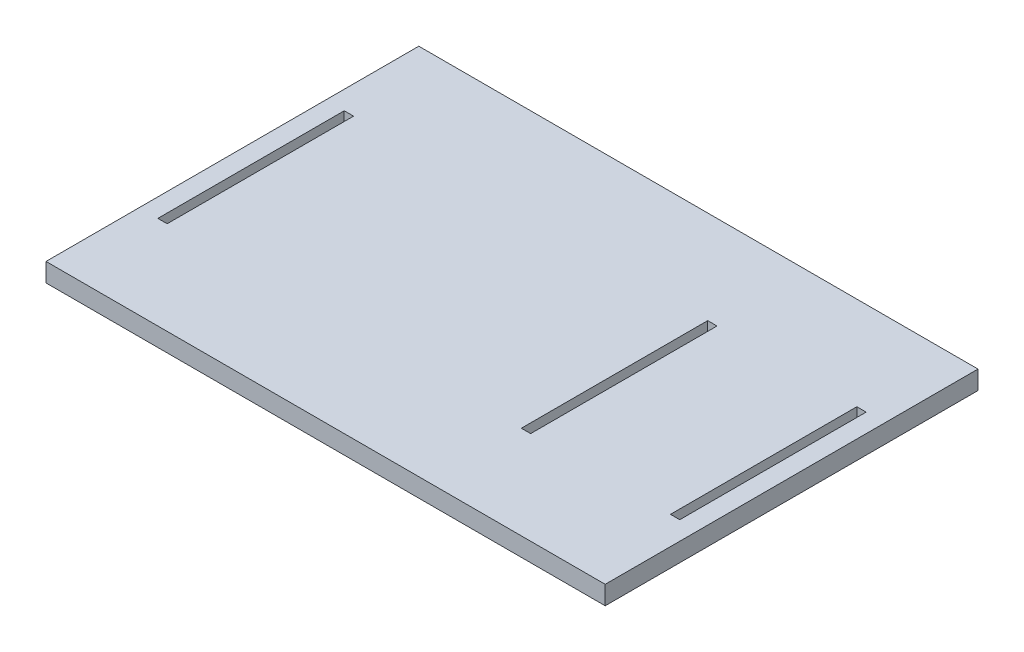
ISO-10303-21;
HEADER;
FILE_DESCRIPTION(('STEP AP214'),'2;1');
FILE_NAME('part.step','',(''),(''),'','','');
FILE_SCHEMA(('AUTOMOTIVE_DESIGN { 1 0 10303 214 1 1 1 1 }'));
ENDSEC;
DATA;
#1=APPLICATION_CONTEXT('core data for automotive mechanical design processes');
#2=APPLICATION_PROTOCOL_DEFINITION('international standard','automotive_design',2000,#1);
#3=PRODUCT_CONTEXT('',#1,'mechanical');
#4=PRODUCT('Part','Part','',(#3));
#5=PRODUCT_RELATED_PRODUCT_CATEGORY('part','',(#4));
#6=PRODUCT_DEFINITION_FORMATION('','',#4);
#7=PRODUCT_DEFINITION_CONTEXT('part definition',#1,'design');
#8=PRODUCT_DEFINITION('design','',#6,#7);
#9=PRODUCT_DEFINITION_SHAPE('','',#8);
#10=(LENGTH_UNIT() NAMED_UNIT(*) SI_UNIT(.MILLI.,.METRE.));
#11=(NAMED_UNIT(*) PLANE_ANGLE_UNIT() SI_UNIT($,.RADIAN.));
#12=(NAMED_UNIT(*) SI_UNIT($,.STERADIAN.) SOLID_ANGLE_UNIT());
#13=UNCERTAINTY_MEASURE_WITH_UNIT(LENGTH_MEASURE(1.E-05),#10,'distance_accuracy_value','');
#14=(GEOMETRIC_REPRESENTATION_CONTEXT(3) GLOBAL_UNCERTAINTY_ASSIGNED_CONTEXT((#13)) GLOBAL_UNIT_ASSIGNED_CONTEXT((#10,
#11,#12)) REPRESENTATION_CONTEXT('',''));
#15=CARTESIAN_POINT('',(0.,0.,0.));
#16=DIRECTION('',(0.,0.,1.));
#17=DIRECTION('',(1.,0.,0.));
#18=AXIS2_PLACEMENT_3D('',#15,#16,#17);
#19=CARTESIAN_POINT('',(0.,10.,0.));
#20=DIRECTION('',(0.,-1.,0.));
#21=DIRECTION('',(0.,0.,-1.));
#22=AXIS2_PLACEMENT_3D('',#19,#20,#21);
#23=PLANE('',#22);
#24=DIRECTION('',(0.,0.,-1.));
#25=VECTOR('',#24,1.);
#26=CARTESIAN_POINT('',(60.0000000000001,10.,50.));
#27=LINE('',#26,#25);
#28=CARTESIAN_POINT('',(60.0000000000001,10.,50.));
#29=VERTEX_POINT('',#28);
#30=CARTESIAN_POINT('',(60.0000000000001,10.,-50.));
#31=VERTEX_POINT('',#30);
#32=EDGE_CURVE('E181',#29,#31,#27,.T.);
#33=ORIENTED_EDGE('',*,*,#32,.F.);
#34=DIRECTION('',(1.,0.,0.));
#35=VECTOR('',#34,1.);
#36=CARTESIAN_POINT('',(55.,10.,50.));
#37=LINE('',#36,#35);
#38=CARTESIAN_POINT('',(55.,10.,50.));
#39=VERTEX_POINT('',#38);
#40=EDGE_CURVE('E189',#39,#29,#37,.T.);
#41=ORIENTED_EDGE('',*,*,#40,.F.);
#42=DIRECTION('',(0.,0.,1.));
#43=VECTOR('',#42,1.);
#44=CARTESIAN_POINT('',(55.,10.,50.));
#45=LINE('',#44,#43);
#46=CARTESIAN_POINT('',(55.,10.,-50.));
#47=VERTEX_POINT('',#46);
#48=EDGE_CURVE('E186',#47,#39,#45,.T.);
#49=ORIENTED_EDGE('',*,*,#48,.F.);
#50=DIRECTION('',(-1.,0.,0.));
#51=VECTOR('',#50,1.);
#52=CARTESIAN_POINT('',(55.,10.,-50.));
#53=LINE('',#52,#51);
#54=EDGE_CURVE('E183',#31,#47,#53,.T.);
#55=ORIENTED_EDGE('',*,*,#54,.F.);
#56=EDGE_LOOP('',(#33,#41,#49,#55));
#57=FACE_BOUND('',#56,.T.);
#58=DIRECTION('',(0.,0.,-1.));
#59=VECTOR('',#58,1.);
#60=CARTESIAN_POINT('',(150.,10.,100.));
#61=LINE('',#60,#59);
#62=CARTESIAN_POINT('',(150.,10.,100.));
#63=VERTEX_POINT('',#62);
#64=CARTESIAN_POINT('',(150.,10.,-100.));
#65=VERTEX_POINT('',#64);
#66=EDGE_CURVE('E243',#63,#65,#61,.T.);
#67=ORIENTED_EDGE('',*,*,#66,.T.);
#68=DIRECTION('',(-1.,0.,0.));
#69=VECTOR('',#68,1.);
#70=CARTESIAN_POINT('',(-150.,10.,-100.));
#71=LINE('',#70,#69);
#72=CARTESIAN_POINT('',(-150.,10.,-100.));
#73=VERTEX_POINT('',#72);
#74=EDGE_CURVE('E246',#65,#73,#71,.T.);
#75=ORIENTED_EDGE('',*,*,#74,.T.);
#76=DIRECTION('',(0.,0.,1.));
#77=VECTOR('',#76,1.);
#78=CARTESIAN_POINT('',(-150.,10.,100.));
#79=LINE('',#78,#77);
#80=CARTESIAN_POINT('',(-150.,10.,100.));
#81=VERTEX_POINT('',#80);
#82=EDGE_CURVE('E249',#73,#81,#79,.T.);
#83=ORIENTED_EDGE('',*,*,#82,.T.);
#84=DIRECTION('',(1.,0.,0.));
#85=VECTOR('',#84,1.);
#86=CARTESIAN_POINT('',(-150.,10.,100.));
#87=LINE('',#86,#85);
#88=EDGE_CURVE('E251',#81,#63,#87,.T.);
#89=ORIENTED_EDGE('',*,*,#88,.T.);
#90=EDGE_LOOP('',(#67,#75,#83,#89));
#91=FACE_BOUND('',#90,.T.);
#92=DIRECTION('',(0.,0.,-1.));
#93=VECTOR('',#92,1.);
#94=CARTESIAN_POINT('',(-135.,10.,50.));
#95=LINE('',#94,#93);
#96=CARTESIAN_POINT('',(-135.,10.,50.));
#97=VERTEX_POINT('',#96);
#98=CARTESIAN_POINT('',(-135.,10.,-50.));
#99=VERTEX_POINT('',#98);
#100=EDGE_CURVE('E212',#97,#99,#95,.T.);
#101=ORIENTED_EDGE('',*,*,#100,.F.);
#102=DIRECTION('',(1.,0.,0.));
#103=VECTOR('',#102,1.);
#104=CARTESIAN_POINT('',(-140.,10.,50.));
#105=LINE('',#104,#103);
#106=CARTESIAN_POINT('',(-140.,10.,50.));
#107=VERTEX_POINT('',#106);
#108=EDGE_CURVE('E220',#107,#97,#105,.T.);
#109=ORIENTED_EDGE('',*,*,#108,.F.);
#110=DIRECTION('',(0.,0.,1.));
#111=VECTOR('',#110,1.);
#112=CARTESIAN_POINT('',(-140.,10.,50.));
#113=LINE('',#112,#111);
#114=CARTESIAN_POINT('',(-140.,10.,-50.));
#115=VERTEX_POINT('',#114);
#116=EDGE_CURVE('E217',#115,#107,#113,.T.);
#117=ORIENTED_EDGE('',*,*,#116,.F.);
#118=DIRECTION('',(-1.,0.,0.));
#119=VECTOR('',#118,1.);
#120=CARTESIAN_POINT('',(-140.,10.,-50.));
#121=LINE('',#120,#119);
#122=EDGE_CURVE('E214',#99,#115,#121,.T.);
#123=ORIENTED_EDGE('',*,*,#122,.F.);
#124=EDGE_LOOP('',(#101,#109,#117,#123));
#125=FACE_BOUND('',#124,.T.);
#126=DIRECTION('',(-1.,0.,0.));
#127=VECTOR('',#126,1.);
#128=CARTESIAN_POINT('',(135.,10.,-50.));
#129=LINE('',#128,#127);
#130=CARTESIAN_POINT('',(140.,10.,-50.));
#131=VERTEX_POINT('',#130);
#132=CARTESIAN_POINT('',(135.,10.,-50.));
#133=VERTEX_POINT('',#132);
#134=EDGE_CURVE('E145',#131,#133,#129,.T.);
#135=ORIENTED_EDGE('',*,*,#134,.F.);
#136=DIRECTION('',(0.,0.,-1.));
#137=VECTOR('',#136,1.);
#138=CARTESIAN_POINT('',(140.,10.,50.));
#139=LINE('',#138,#137);
#140=CARTESIAN_POINT('',(140.,10.,50.));
#141=VERTEX_POINT('',#140);
#142=EDGE_CURVE('E167',#141,#131,#139,.T.);
#143=ORIENTED_EDGE('',*,*,#142,.F.);
#144=DIRECTION('',(1.,0.,0.));
#145=VECTOR('',#144,1.);
#146=CARTESIAN_POINT('',(135.,10.,50.));
#147=LINE('',#146,#145);
#148=CARTESIAN_POINT('',(135.,10.,50.));
#149=VERTEX_POINT('',#148);
#150=EDGE_CURVE('E165',#149,#141,#147,.T.);
#151=ORIENTED_EDGE('',*,*,#150,.F.);
#152=DIRECTION('',(0.,0.,1.));
#153=VECTOR('',#152,1.);
#154=CARTESIAN_POINT('',(135.,10.,50.));
#155=LINE('',#154,#153);
#156=EDGE_CURVE('E153',#133,#149,#155,.T.);
#157=ORIENTED_EDGE('',*,*,#156,.F.);
#158=EDGE_LOOP('',(#135,#143,#151,#157));
#159=FACE_BOUND('',#158,.T.);
#160=ADVANCED_FACE('F32',(#57,#91,#125,#159),#23,.F.);
#161=CARTESIAN_POINT('',(0.,0.,0.));
#162=DIRECTION('',(0.,-1.,0.));
#163=DIRECTION('',(0.,0.,-1.));
#164=AXIS2_PLACEMENT_3D('',#161,#162,#163);
#165=PLANE('',#164);
#166=DIRECTION('',(1.,0.,0.));
#167=VECTOR('',#166,1.);
#168=CARTESIAN_POINT('',(55.,0.,50.));
#169=LINE('',#168,#167);
#170=CARTESIAN_POINT('',(55.,0.,50.));
#171=VERTEX_POINT('',#170);
#172=CARTESIAN_POINT('',(60.0000000000001,0.,50.));
#173=VERTEX_POINT('',#172);
#174=EDGE_CURVE('E184',#171,#173,#169,.T.);
#175=ORIENTED_EDGE('',*,*,#174,.T.);
#176=DIRECTION('',(0.,0.,-1.));
#177=VECTOR('',#176,1.);
#178=CARTESIAN_POINT('',(60.0000000000001,0.,50.));
#179=LINE('',#178,#177);
#180=CARTESIAN_POINT('',(60.0000000000001,0.,-50.));
#181=VERTEX_POINT('',#180);
#182=EDGE_CURVE('E161',#173,#181,#179,.T.);
#183=ORIENTED_EDGE('',*,*,#182,.T.);
#184=DIRECTION('',(-1.,0.,0.));
#185=VECTOR('',#184,1.);
#186=CARTESIAN_POINT('',(55.,0.,-50.));
#187=LINE('',#186,#185);
#188=CARTESIAN_POINT('',(55.,0.,-50.));
#189=VERTEX_POINT('',#188);
#190=EDGE_CURVE('E194',#181,#189,#187,.T.);
#191=ORIENTED_EDGE('',*,*,#190,.T.);
#192=DIRECTION('',(0.,0.,1.));
#193=VECTOR('',#192,1.);
#194=CARTESIAN_POINT('',(55.,0.,50.));
#195=LINE('',#194,#193);
#196=EDGE_CURVE('E197',#189,#171,#195,.T.);
#197=ORIENTED_EDGE('',*,*,#196,.T.);
#198=EDGE_LOOP('',(#175,#183,#191,#197));
#199=FACE_BOUND('',#198,.T.);
#200=DIRECTION('',(0.,0.,-1.));
#201=VECTOR('',#200,1.);
#202=CARTESIAN_POINT('',(150.,0.,100.));
#203=LINE('',#202,#201);
#204=CARTESIAN_POINT('',(150.,0.,100.));
#205=VERTEX_POINT('',#204);
#206=CARTESIAN_POINT('',(150.,0.,-100.));
#207=VERTEX_POINT('',#206);
#208=EDGE_CURVE('E242',#205,#207,#203,.T.);
#209=ORIENTED_EDGE('',*,*,#208,.F.);
#210=DIRECTION('',(1.,0.,0.));
#211=VECTOR('',#210,1.);
#212=CARTESIAN_POINT('',(-150.,0.,100.));
#213=LINE('',#212,#211);
#214=CARTESIAN_POINT('',(-150.,0.,100.));
#215=VERTEX_POINT('',#214);
#216=EDGE_CURVE('E247',#215,#205,#213,.T.);
#217=ORIENTED_EDGE('',*,*,#216,.F.);
#218=DIRECTION('',(0.,0.,1.));
#219=VECTOR('',#218,1.);
#220=CARTESIAN_POINT('',(-150.,0.,100.));
#221=LINE('',#220,#219);
#222=CARTESIAN_POINT('',(-150.,0.,-100.));
#223=VERTEX_POINT('',#222);
#224=EDGE_CURVE('E258',#223,#215,#221,.T.);
#225=ORIENTED_EDGE('',*,*,#224,.F.);
#226=DIRECTION('',(-1.,0.,0.));
#227=VECTOR('',#226,1.);
#228=CARTESIAN_POINT('',(-150.,0.,-100.));
#229=LINE('',#228,#227);
#230=EDGE_CURVE('E256',#207,#223,#229,.T.);
#231=ORIENTED_EDGE('',*,*,#230,.F.);
#232=EDGE_LOOP('',(#209,#217,#225,#231));
#233=FACE_BOUND('',#232,.T.);
#234=DIRECTION('',(1.,0.,0.));
#235=VECTOR('',#234,1.);
#236=CARTESIAN_POINT('',(-140.,0.,50.));
#237=LINE('',#236,#235);
#238=CARTESIAN_POINT('',(-140.,0.,50.));
#239=VERTEX_POINT('',#238);
#240=CARTESIAN_POINT('',(-135.,0.,50.));
#241=VERTEX_POINT('',#240);
#242=EDGE_CURVE('E215',#239,#241,#237,.T.);
#243=ORIENTED_EDGE('',*,*,#242,.T.);
#244=DIRECTION('',(0.,0.,-1.));
#245=VECTOR('',#244,1.);
#246=CARTESIAN_POINT('',(-135.,0.,50.));
#247=LINE('',#246,#245);
#248=CARTESIAN_POINT('',(-135.,0.,-50.));
#249=VERTEX_POINT('',#248);
#250=EDGE_CURVE('E211',#241,#249,#247,.T.);
#251=ORIENTED_EDGE('',*,*,#250,.T.);
#252=DIRECTION('',(-1.,0.,0.));
#253=VECTOR('',#252,1.);
#254=CARTESIAN_POINT('',(-140.,0.,-50.));
#255=LINE('',#254,#253);
#256=CARTESIAN_POINT('',(-140.,0.,-50.));
#257=VERTEX_POINT('',#256);
#258=EDGE_CURVE('E225',#249,#257,#255,.T.);
#259=ORIENTED_EDGE('',*,*,#258,.T.);
#260=DIRECTION('',(0.,0.,1.));
#261=VECTOR('',#260,1.);
#262=CARTESIAN_POINT('',(-140.,0.,50.));
#263=LINE('',#262,#261);
#264=EDGE_CURVE('E228',#257,#239,#263,.T.);
#265=ORIENTED_EDGE('',*,*,#264,.T.);
#266=EDGE_LOOP('',(#243,#251,#259,#265));
#267=FACE_BOUND('',#266,.T.);
#268=DIRECTION('',(0.,0.,-1.));
#269=VECTOR('',#268,1.);
#270=CARTESIAN_POINT('',(140.,0.,50.));
#271=LINE('',#270,#269);
#272=CARTESIAN_POINT('',(140.,0.,50.));
#273=VERTEX_POINT('',#272);
#274=CARTESIAN_POINT('',(140.,0.,-50.));
#275=VERTEX_POINT('',#274);
#276=EDGE_CURVE('E154',#273,#275,#271,.T.);
#277=ORIENTED_EDGE('',*,*,#276,.T.);
#278=DIRECTION('',(-1.,0.,0.));
#279=VECTOR('',#278,1.);
#280=CARTESIAN_POINT('',(135.,0.,-50.));
#281=LINE('',#280,#279);
#282=CARTESIAN_POINT('',(135.,0.,-50.));
#283=VERTEX_POINT('',#282);
#284=EDGE_CURVE('E55',#275,#283,#281,.T.);
#285=ORIENTED_EDGE('',*,*,#284,.T.);
#286=DIRECTION('',(0.,0.,1.));
#287=VECTOR('',#286,1.);
#288=CARTESIAN_POINT('',(135.,0.,50.));
#289=LINE('',#288,#287);
#290=CARTESIAN_POINT('',(135.,0.,50.));
#291=VERTEX_POINT('',#290);
#292=EDGE_CURVE('E160',#283,#291,#289,.T.);
#293=ORIENTED_EDGE('',*,*,#292,.T.);
#294=DIRECTION('',(1.,0.,0.));
#295=VECTOR('',#294,1.);
#296=CARTESIAN_POINT('',(135.,0.,50.));
#297=LINE('',#296,#295);
#298=EDGE_CURVE('E173',#291,#273,#297,.T.);
#299=ORIENTED_EDGE('',*,*,#298,.T.);
#300=EDGE_LOOP('',(#277,#285,#293,#299));
#301=FACE_BOUND('',#300,.T.);
#302=ADVANCED_FACE('F276',(#199,#233,#267,#301),#165,.T.);
#303=CARTESIAN_POINT('',(150.,10.,100.));
#304=DIRECTION('',(-1.,0.,0.));
#305=DIRECTION('',(0.,0.,1.));
#306=AXIS2_PLACEMENT_3D('',#303,#304,#305);
#307=PLANE('',#306);
#308=ORIENTED_EDGE('',*,*,#208,.T.);
#309=DIRECTION('',(0.,-1.,0.));
#310=VECTOR('',#309,1.);
#311=CARTESIAN_POINT('',(150.,10.,-100.));
#312=LINE('',#311,#310);
#313=EDGE_CURVE('E11',#65,#207,#312,.T.);
#314=ORIENTED_EDGE('',*,*,#313,.F.);
#315=ORIENTED_EDGE('',*,*,#66,.F.);
#316=DIRECTION('',(0.,-1.,0.));
#317=VECTOR('',#316,1.);
#318=CARTESIAN_POINT('',(150.,10.,100.));
#319=LINE('',#318,#317);
#320=EDGE_CURVE('E253',#63,#205,#319,.T.);
#321=ORIENTED_EDGE('',*,*,#320,.T.);
#322=EDGE_LOOP('',(#308,#314,#315,#321));
#323=FACE_BOUND('',#322,.T.);
#324=ADVANCED_FACE('F34',(#323),#307,.F.);
#325=CARTESIAN_POINT('',(-150.,10.,-100.));
#326=DIRECTION('',(0.,0.,1.));
#327=DIRECTION('',(1.,0.,0.));
#328=AXIS2_PLACEMENT_3D('',#325,#326,#327);
#329=PLANE('',#328);
#330=ORIENTED_EDGE('',*,*,#230,.T.);
#331=DIRECTION('',(0.,-1.,0.));
#332=VECTOR('',#331,1.);
#333=CARTESIAN_POINT('',(-150.,10.,-100.));
#334=LINE('',#333,#332);
#335=EDGE_CURVE('E40',#73,#223,#334,.T.);
#336=ORIENTED_EDGE('',*,*,#335,.F.);
#337=ORIENTED_EDGE('',*,*,#74,.F.);
#338=ORIENTED_EDGE('',*,*,#313,.T.);
#339=EDGE_LOOP('',(#330,#336,#337,#338));
#340=FACE_BOUND('',#339,.T.);
#341=ADVANCED_FACE('F287',(#340),#329,.F.);
#342=CARTESIAN_POINT('',(-150.,10.,100.));
#343=DIRECTION('',(1.,0.,0.));
#344=DIRECTION('',(0.,0.,-1.));
#345=AXIS2_PLACEMENT_3D('',#342,#343,#344);
#346=PLANE('',#345);
#347=ORIENTED_EDGE('',*,*,#224,.T.);
#348=DIRECTION('',(0.,-1.,0.));
#349=VECTOR('',#348,1.);
#350=CARTESIAN_POINT('',(-150.,10.,100.));
#351=LINE('',#350,#349);
#352=EDGE_CURVE('E263',#81,#215,#351,.T.);
#353=ORIENTED_EDGE('',*,*,#352,.F.);
#354=ORIENTED_EDGE('',*,*,#82,.F.);
#355=ORIENTED_EDGE('',*,*,#335,.T.);
#356=EDGE_LOOP('',(#347,#353,#354,#355));
#357=FACE_BOUND('',#356,.T.);
#358=ADVANCED_FACE('F270',(#357),#346,.F.);
#359=CARTESIAN_POINT('',(-150.,10.,100.));
#360=DIRECTION('',(0.,0.,-1.));
#361=DIRECTION('',(-1.,0.,0.));
#362=AXIS2_PLACEMENT_3D('',#359,#360,#361);
#363=PLANE('',#362);
#364=ORIENTED_EDGE('',*,*,#216,.T.);
#365=ORIENTED_EDGE('',*,*,#320,.F.);
#366=ORIENTED_EDGE('',*,*,#88,.F.);
#367=ORIENTED_EDGE('',*,*,#352,.T.);
#368=EDGE_LOOP('',(#364,#365,#366,#367));
#369=FACE_BOUND('',#368,.T.);
#370=ADVANCED_FACE('F280',(#369),#363,.F.);
#371=CARTESIAN_POINT('',(-135.,10.,50.));
#372=DIRECTION('',(-1.,0.,0.));
#373=DIRECTION('',(0.,0.,1.));
#374=AXIS2_PLACEMENT_3D('',#371,#372,#373);
#375=PLANE('',#374);
#376=ORIENTED_EDGE('',*,*,#250,.F.);
#377=DIRECTION('',(0.,-1.,0.));
#378=VECTOR('',#377,1.);
#379=CARTESIAN_POINT('',(-135.,10.,50.));
#380=LINE('',#379,#378);
#381=EDGE_CURVE('E222',#97,#241,#380,.T.);
#382=ORIENTED_EDGE('',*,*,#381,.F.);
#383=ORIENTED_EDGE('',*,*,#100,.T.);
#384=DIRECTION('',(0.,-1.,0.));
#385=VECTOR('',#384,1.);
#386=CARTESIAN_POINT('',(-135.,10.,-50.));
#387=LINE('',#386,#385);
#388=EDGE_CURVE('E239',#99,#249,#387,.T.);
#389=ORIENTED_EDGE('',*,*,#388,.T.);
#390=EDGE_LOOP('',(#376,#382,#383,#389));
#391=FACE_BOUND('',#390,.T.);
#392=ADVANCED_FACE('F304',(#391),#375,.T.);
#393=CARTESIAN_POINT('',(-140.,10.,-50.));
#394=DIRECTION('',(0.,0.,1.));
#395=DIRECTION('',(1.,0.,0.));
#396=AXIS2_PLACEMENT_3D('',#393,#394,#395);
#397=PLANE('',#396);
#398=ORIENTED_EDGE('',*,*,#258,.F.);
#399=ORIENTED_EDGE('',*,*,#388,.F.);
#400=ORIENTED_EDGE('',*,*,#122,.T.);
#401=DIRECTION('',(0.,-1.,0.));
#402=VECTOR('',#401,1.);
#403=CARTESIAN_POINT('',(-140.,10.,-50.));
#404=LINE('',#403,#402);
#405=EDGE_CURVE('E237',#115,#257,#404,.T.);
#406=ORIENTED_EDGE('',*,*,#405,.T.);
#407=EDGE_LOOP('',(#398,#399,#400,#406));
#408=FACE_BOUND('',#407,.T.);
#409=ADVANCED_FACE('F311',(#408),#397,.T.);
#410=CARTESIAN_POINT('',(-140.,10.,50.));
#411=DIRECTION('',(1.,0.,0.));
#412=DIRECTION('',(0.,0.,-1.));
#413=AXIS2_PLACEMENT_3D('',#410,#411,#412);
#414=PLANE('',#413);
#415=ORIENTED_EDGE('',*,*,#264,.F.);
#416=ORIENTED_EDGE('',*,*,#405,.F.);
#417=ORIENTED_EDGE('',*,*,#116,.T.);
#418=DIRECTION('',(0.,-1.,0.));
#419=VECTOR('',#418,1.);
#420=CARTESIAN_POINT('',(-140.,10.,50.));
#421=LINE('',#420,#419);
#422=EDGE_CURVE('E235',#107,#239,#421,.T.);
#423=ORIENTED_EDGE('',*,*,#422,.T.);
#424=EDGE_LOOP('',(#415,#416,#417,#423));
#425=FACE_BOUND('',#424,.T.);
#426=ADVANCED_FACE('F316',(#425),#414,.T.);
#427=CARTESIAN_POINT('',(-140.,10.,50.));
#428=DIRECTION('',(0.,0.,-1.));
#429=DIRECTION('',(-1.,0.,0.));
#430=AXIS2_PLACEMENT_3D('',#427,#428,#429);
#431=PLANE('',#430);
#432=ORIENTED_EDGE('',*,*,#242,.F.);
#433=ORIENTED_EDGE('',*,*,#422,.F.);
#434=ORIENTED_EDGE('',*,*,#108,.T.);
#435=ORIENTED_EDGE('',*,*,#381,.T.);
#436=EDGE_LOOP('',(#432,#433,#434,#435));
#437=FACE_BOUND('',#436,.T.);
#438=ADVANCED_FACE('F323',(#437),#431,.T.);
#439=CARTESIAN_POINT('',(60.0000000000001,10.,50.));
#440=DIRECTION('',(-1.,0.,0.));
#441=DIRECTION('',(0.,0.,1.));
#442=AXIS2_PLACEMENT_3D('',#439,#440,#441);
#443=PLANE('',#442);
#444=ORIENTED_EDGE('',*,*,#182,.F.);
#445=DIRECTION('',(0.,-1.,0.));
#446=VECTOR('',#445,1.);
#447=CARTESIAN_POINT('',(60.0000000000001,10.,50.));
#448=LINE('',#447,#446);
#449=EDGE_CURVE('E191',#29,#173,#448,.T.);
#450=ORIENTED_EDGE('',*,*,#449,.F.);
#451=ORIENTED_EDGE('',*,*,#32,.T.);
#452=DIRECTION('',(0.,-1.,0.));
#453=VECTOR('',#452,1.);
#454=CARTESIAN_POINT('',(60.0000000000001,10.,-50.));
#455=LINE('',#454,#453);
#456=EDGE_CURVE('E208',#31,#181,#455,.T.);
#457=ORIENTED_EDGE('',*,*,#456,.T.);
#458=EDGE_LOOP('',(#444,#450,#451,#457));
#459=FACE_BOUND('',#458,.T.);
#460=ADVANCED_FACE('F336',(#459),#443,.T.);
#461=CARTESIAN_POINT('',(55.,10.,-50.));
#462=DIRECTION('',(0.,0.,1.));
#463=DIRECTION('',(1.,0.,0.));
#464=AXIS2_PLACEMENT_3D('',#461,#462,#463);
#465=PLANE('',#464);
#466=ORIENTED_EDGE('',*,*,#190,.F.);
#467=ORIENTED_EDGE('',*,*,#456,.F.);
#468=ORIENTED_EDGE('',*,*,#54,.T.);
#469=DIRECTION('',(0.,-1.,0.));
#470=VECTOR('',#469,1.);
#471=CARTESIAN_POINT('',(55.,10.,-50.));
#472=LINE('',#471,#470);
#473=EDGE_CURVE('E206',#47,#189,#472,.T.);
#474=ORIENTED_EDGE('',*,*,#473,.T.);
#475=EDGE_LOOP('',(#466,#467,#468,#474));
#476=FACE_BOUND('',#475,.T.);
#477=ADVANCED_FACE('F341',(#476),#465,.T.);
#478=CARTESIAN_POINT('',(55.,10.,50.));
#479=DIRECTION('',(1.,0.,0.));
#480=DIRECTION('',(0.,0.,-1.));
#481=AXIS2_PLACEMENT_3D('',#478,#479,#480);
#482=PLANE('',#481);
#483=ORIENTED_EDGE('',*,*,#196,.F.);
#484=ORIENTED_EDGE('',*,*,#473,.F.);
#485=ORIENTED_EDGE('',*,*,#48,.T.);
#486=DIRECTION('',(0.,-1.,0.));
#487=VECTOR('',#486,1.);
#488=CARTESIAN_POINT('',(55.,10.,50.));
#489=LINE('',#488,#487);
#490=EDGE_CURVE('E204',#39,#171,#489,.T.);
#491=ORIENTED_EDGE('',*,*,#490,.T.);
#492=EDGE_LOOP('',(#483,#484,#485,#491));
#493=FACE_BOUND('',#492,.T.);
#494=ADVANCED_FACE('F345',(#493),#482,.T.);
#495=CARTESIAN_POINT('',(55.,10.,50.));
#496=DIRECTION('',(0.,0.,-1.));
#497=DIRECTION('',(-1.,0.,0.));
#498=AXIS2_PLACEMENT_3D('',#495,#496,#497);
#499=PLANE('',#498);
#500=ORIENTED_EDGE('',*,*,#174,.F.);
#501=ORIENTED_EDGE('',*,*,#490,.F.);
#502=ORIENTED_EDGE('',*,*,#40,.T.);
#503=ORIENTED_EDGE('',*,*,#449,.T.);
#504=EDGE_LOOP('',(#500,#501,#502,#503));
#505=FACE_BOUND('',#504,.T.);
#506=ADVANCED_FACE('F349',(#505),#499,.T.);
#507=CARTESIAN_POINT('',(135.,10.,-50.));
#508=DIRECTION('',(0.,0.,1.));
#509=DIRECTION('',(1.,0.,0.));
#510=AXIS2_PLACEMENT_3D('',#507,#508,#509);
#511=PLANE('',#510);
#512=ORIENTED_EDGE('',*,*,#284,.F.);
#513=DIRECTION('',(0.,-1.,0.));
#514=VECTOR('',#513,1.);
#515=CARTESIAN_POINT('',(140.,10.,-50.));
#516=LINE('',#515,#514);
#517=EDGE_CURVE('E149',#131,#275,#516,.T.);
#518=ORIENTED_EDGE('',*,*,#517,.F.);
#519=ORIENTED_EDGE('',*,*,#134,.T.);
#520=DIRECTION('',(0.,-1.,0.));
#521=VECTOR('',#520,1.);
#522=CARTESIAN_POINT('',(135.,10.,-50.));
#523=LINE('',#522,#521);
#524=EDGE_CURVE('E148',#133,#283,#523,.T.);
#525=ORIENTED_EDGE('',*,*,#524,.T.);
#526=EDGE_LOOP('',(#512,#518,#519,#525));
#527=FACE_BOUND('',#526,.T.);
#528=ADVANCED_FACE('F147',(#527),#511,.T.);
#529=CARTESIAN_POINT('',(135.,10.,50.));
#530=DIRECTION('',(1.,0.,0.));
#531=DIRECTION('',(0.,0.,-1.));
#532=AXIS2_PLACEMENT_3D('',#529,#530,#531);
#533=PLANE('',#532);
#534=ORIENTED_EDGE('',*,*,#292,.F.);
#535=ORIENTED_EDGE('',*,*,#524,.F.);
#536=ORIENTED_EDGE('',*,*,#156,.T.);
#537=DIRECTION('',(0.,-1.,0.));
#538=VECTOR('',#537,1.);
#539=CARTESIAN_POINT('',(135.,10.,50.));
#540=LINE('',#539,#538);
#541=EDGE_CURVE('E162',#149,#291,#540,.T.);
#542=ORIENTED_EDGE('',*,*,#541,.T.);
#543=EDGE_LOOP('',(#534,#535,#536,#542));
#544=FACE_BOUND('',#543,.T.);
#545=ADVANCED_FACE('F157',(#544),#533,.T.);
#546=CARTESIAN_POINT('',(135.,10.,50.));
#547=DIRECTION('',(0.,0.,-1.));
#548=DIRECTION('',(-1.,0.,0.));
#549=AXIS2_PLACEMENT_3D('',#546,#547,#548);
#550=PLANE('',#549);
#551=ORIENTED_EDGE('',*,*,#298,.F.);
#552=ORIENTED_EDGE('',*,*,#541,.F.);
#553=ORIENTED_EDGE('',*,*,#150,.T.);
#554=DIRECTION('',(0.,-1.,0.));
#555=VECTOR('',#554,1.);
#556=CARTESIAN_POINT('',(140.,10.,50.));
#557=LINE('',#556,#555);
#558=EDGE_CURVE('E47',#141,#273,#557,.T.);
#559=ORIENTED_EDGE('',*,*,#558,.T.);
#560=EDGE_LOOP('',(#551,#552,#553,#559));
#561=FACE_BOUND('',#560,.T.);
#562=ADVANCED_FACE('F358',(#561),#550,.T.);
#563=CARTESIAN_POINT('',(140.,10.,50.));
#564=DIRECTION('',(-1.,0.,0.));
#565=DIRECTION('',(0.,0.,1.));
#566=AXIS2_PLACEMENT_3D('',#563,#564,#565);
#567=PLANE('',#566);
#568=ORIENTED_EDGE('',*,*,#276,.F.);
#569=ORIENTED_EDGE('',*,*,#558,.F.);
#570=ORIENTED_EDGE('',*,*,#142,.T.);
#571=ORIENTED_EDGE('',*,*,#517,.T.);
#572=EDGE_LOOP('',(#568,#569,#570,#571));
#573=FACE_BOUND('',#572,.T.);
#574=ADVANCED_FACE('F361',(#573),#567,.T.);
#575=CLOSED_SHELL('',(#160,#302,#324,#341,#358,#370,#392,#409,#426,#438,#460,#477,#494,#506,
#528,#545,#562,#574));
#576=MANIFOLD_SOLID_BREP('B2',#575);
#577=ADVANCED_BREP_SHAPE_REPRESENTATION('',(#18,#576),#14);
#578=SHAPE_DEFINITION_REPRESENTATION(#9,#577);
ENDSEC;
END-ISO-10303-21;
